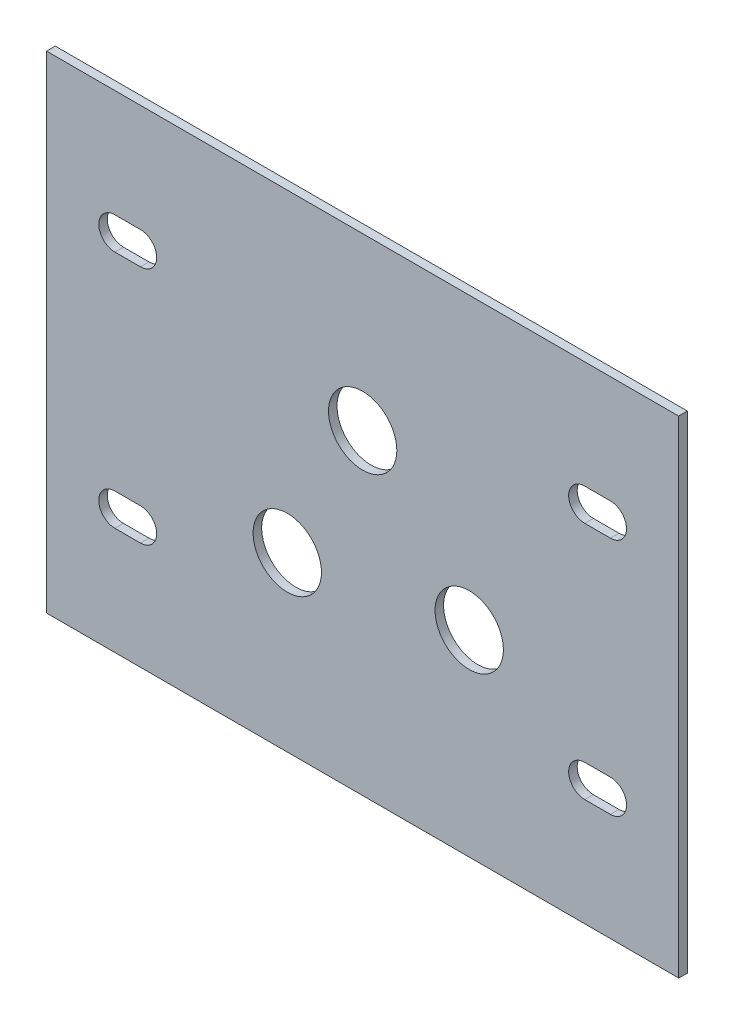
ISO-10303-21;
HEADER;
FILE_DESCRIPTION(('STEP AP214'),'2;1');
FILE_NAME('part.step','',(''),(''),'','','');
FILE_SCHEMA(('AUTOMOTIVE_DESIGN { 1 0 10303 214 1 1 1 1 }'));
ENDSEC;
DATA;
#1=APPLICATION_CONTEXT('core data for automotive mechanical design processes');
#2=APPLICATION_PROTOCOL_DEFINITION('international standard','automotive_design',2000,#1);
#3=PRODUCT_CONTEXT('',#1,'mechanical');
#4=PRODUCT('Part','Part','',(#3));
#5=PRODUCT_RELATED_PRODUCT_CATEGORY('part','',(#4));
#6=PRODUCT_DEFINITION_FORMATION('','',#4);
#7=PRODUCT_DEFINITION_CONTEXT('part definition',#1,'design');
#8=PRODUCT_DEFINITION('design','',#6,#7);
#9=PRODUCT_DEFINITION_SHAPE('','',#8);
#10=(LENGTH_UNIT() NAMED_UNIT(*) SI_UNIT(.MILLI.,.METRE.));
#11=(NAMED_UNIT(*) PLANE_ANGLE_UNIT() SI_UNIT($,.RADIAN.));
#12=(NAMED_UNIT(*) SI_UNIT($,.STERADIAN.) SOLID_ANGLE_UNIT());
#13=UNCERTAINTY_MEASURE_WITH_UNIT(LENGTH_MEASURE(1.E-05),#10,'distance_accuracy_value','');
#14=(GEOMETRIC_REPRESENTATION_CONTEXT(3) GLOBAL_UNCERTAINTY_ASSIGNED_CONTEXT((#13)) GLOBAL_UNIT_ASSIGNED_CONTEXT((#10,
#11,#12)) REPRESENTATION_CONTEXT('',''));
#15=CARTESIAN_POINT('',(0.,0.,0.));
#16=DIRECTION('',(0.,0.,1.));
#17=DIRECTION('',(1.,0.,0.));
#18=AXIS2_PLACEMENT_3D('',#15,#16,#17);
#19=CARTESIAN_POINT('',(0.,-90.4875,0.));
#20=DIRECTION('',(0.,-0.999847695156391,0.0174524064372835));
#21=DIRECTION('',(-1.,0.,0.));
#22=AXIS2_PLACEMENT_3D('',#19,#20,#21);
#23=PLANE('',#22);
#24=DIRECTION('',(1.,0.,0.));
#25=VECTOR('',#24,1.);
#26=CARTESIAN_POINT('',(0.,-90.4875,0.));
#27=LINE('',#26,#25);
#28=CARTESIAN_POINT('',(-117.475,-90.4875,0.));
#29=VERTEX_POINT('',#28);
#30=CARTESIAN_POINT('',(117.475,-90.4875,0.));
#31=VERTEX_POINT('',#30);
#32=EDGE_CURVE('E296',#29,#31,#27,.T.);
#33=ORIENTED_EDGE('',*,*,#32,.T.);
#34=DIRECTION('',(0.0174497491606827,-0.0174497491606827,-0.999695459881887));
#35=VECTOR('',#34,1.);
#36=CARTESIAN_POINT('',(117.44744712218,-90.4599471221796,1.57850331314946));
#37=LINE('',#36,#35);
#38=CARTESIAN_POINT('',(117.419580168853,-90.4320801688529,3.175));
#39=VERTEX_POINT('',#38);
#40=EDGE_CURVE('E10',#39,#31,#37,.T.);
#41=ORIENTED_EDGE('',*,*,#40,.F.);
#42=DIRECTION('',(1.,0.,0.));
#43=VECTOR('',#42,1.);
#44=CARTESIAN_POINT('',(0.,-90.4320801688529,3.175));
#45=LINE('',#44,#43);
#46=CARTESIAN_POINT('',(-117.419580168853,-90.4320801688529,3.175));
#47=VERTEX_POINT('',#46);
#48=EDGE_CURVE('E332',#47,#39,#45,.T.);
#49=ORIENTED_EDGE('',*,*,#48,.F.);
#50=DIRECTION('',(-0.0174497491606827,-0.0174497491606827,-0.999695459881887));
#51=VECTOR('',#50,1.);
#52=CARTESIAN_POINT('',(-117.44744712218,-90.4599471221796,1.57850331314946));
#53=LINE('',#52,#51);
#54=EDGE_CURVE('E350',#47,#29,#53,.T.);
#55=ORIENTED_EDGE('',*,*,#54,.T.);
#56=EDGE_LOOP('',(#33,#41,#49,#55));
#57=FACE_BOUND('',#56,.T.);
#58=ADVANCED_FACE('F16',(#57),#23,.T.);
#59=CARTESIAN_POINT('',(117.475,0.,0.));
#60=DIRECTION('',(0.999847695156391,0.,0.0174524064372835));
#61=DIRECTION('',(0.,-1.,0.));
#62=AXIS2_PLACEMENT_3D('',#59,#60,#61);
#63=PLANE('',#62);
#64=DIRECTION('',(0.,1.,0.));
#65=VECTOR('',#64,1.);
#66=CARTESIAN_POINT('',(117.475,0.,0.));
#67=LINE('',#66,#65);
#68=CARTESIAN_POINT('',(117.475,90.4875,0.));
#69=VERTEX_POINT('',#68);
#70=EDGE_CURVE('E327',#31,#69,#67,.T.);
#71=ORIENTED_EDGE('',*,*,#70,.T.);
#72=DIRECTION('',(0.0174497491606827,0.0174497491606827,-0.999695459881887));
#73=VECTOR('',#72,1.);
#74=CARTESIAN_POINT('',(117.44744712218,90.4599471221795,1.57850331314946));
#75=LINE('',#74,#73);
#76=CARTESIAN_POINT('',(117.419580168853,90.4320801688529,3.175));
#77=VERTEX_POINT('',#76);
#78=EDGE_CURVE('E27',#77,#69,#75,.T.);
#79=ORIENTED_EDGE('',*,*,#78,.F.);
#80=DIRECTION('',(0.,1.,0.));
#81=VECTOR('',#80,1.);
#82=CARTESIAN_POINT('',(117.419580168853,0.,3.175));
#83=LINE('',#82,#81);
#84=EDGE_CURVE('E337',#39,#77,#83,.T.);
#85=ORIENTED_EDGE('',*,*,#84,.F.);
#86=ORIENTED_EDGE('',*,*,#40,.T.);
#87=EDGE_LOOP('',(#71,#79,#85,#86));
#88=FACE_BOUND('',#87,.T.);
#89=ADVANCED_FACE('F18',(#88),#63,.T.);
#90=CARTESIAN_POINT('',(0.,90.4875,0.));
#91=DIRECTION('',(0.,0.999847695156391,0.0174524064372835));
#92=DIRECTION('',(1.,0.,0.));
#93=AXIS2_PLACEMENT_3D('',#90,#91,#92);
#94=PLANE('',#93);
#95=DIRECTION('',(1.,0.,0.));
#96=VECTOR('',#95,1.);
#97=CARTESIAN_POINT('',(0.,90.4875,0.));
#98=LINE('',#97,#96);
#99=CARTESIAN_POINT('',(-117.475,90.4875,0.));
#100=VERTEX_POINT('',#99);
#101=EDGE_CURVE('E323',#100,#69,#98,.T.);
#102=ORIENTED_EDGE('',*,*,#101,.F.);
#103=DIRECTION('',(-0.0174497491606827,0.0174497491606827,-0.999695459881887));
#104=VECTOR('',#103,1.);
#105=CARTESIAN_POINT('',(-117.44744712218,90.4599471221795,1.57850331314946));
#106=LINE('',#105,#104);
#107=CARTESIAN_POINT('',(-117.419580168853,90.4320801688529,3.175));
#108=VERTEX_POINT('',#107);
#109=EDGE_CURVE('E20',#108,#100,#106,.T.);
#110=ORIENTED_EDGE('',*,*,#109,.F.);
#111=DIRECTION('',(1.,0.,0.));
#112=VECTOR('',#111,1.);
#113=CARTESIAN_POINT('',(0.,90.4320801688529,3.175));
#114=LINE('',#113,#112);
#115=EDGE_CURVE('E341',#108,#77,#114,.T.);
#116=ORIENTED_EDGE('',*,*,#115,.T.);
#117=ORIENTED_EDGE('',*,*,#78,.T.);
#118=EDGE_LOOP('',(#102,#110,#116,#117));
#119=FACE_BOUND('',#118,.T.);
#120=ADVANCED_FACE('F363',(#119),#94,.T.);
#121=CARTESIAN_POINT('',(-117.475,0.,0.));
#122=DIRECTION('',(-0.999847695156391,0.,0.0174524064372835));
#123=DIRECTION('',(0.,1.,0.));
#124=AXIS2_PLACEMENT_3D('',#121,#122,#123);
#125=PLANE('',#124);
#126=DIRECTION('',(0.,1.,0.));
#127=VECTOR('',#126,1.);
#128=CARTESIAN_POINT('',(-117.475,0.,0.));
#129=LINE('',#128,#127);
#130=EDGE_CURVE('E299',#29,#100,#129,.T.);
#131=ORIENTED_EDGE('',*,*,#130,.F.);
#132=ORIENTED_EDGE('',*,*,#54,.F.);
#133=DIRECTION('',(0.,1.,0.));
#134=VECTOR('',#133,1.);
#135=CARTESIAN_POINT('',(-117.419580168853,0.,3.175));
#136=LINE('',#135,#134);
#137=EDGE_CURVE('E342',#47,#108,#136,.T.);
#138=ORIENTED_EDGE('',*,*,#137,.T.);
#139=ORIENTED_EDGE('',*,*,#109,.T.);
#140=EDGE_LOOP('',(#131,#132,#138,#139));
#141=FACE_BOUND('',#140,.T.);
#142=ADVANCED_FACE('F360',(#141),#125,.T.);
#143=CARTESIAN_POINT('',(0.,0.,3.175));
#144=DIRECTION('',(0.,0.,1.));
#145=DIRECTION('',(1.,0.,0.));
#146=AXIS2_PLACEMENT_3D('',#143,#144,#145);
#147=PLANE('',#146);
#148=CARTESIAN_POINT('',(39.6028704669127,-17.3651704669118,3.175));
#149=DIRECTION('',(0.,0.,1.));
#150=DIRECTION('',(1.,0.,0.));
#151=AXIS2_PLACEMENT_3D('',#148,#149,#150);
#152=CIRCLE('',#151,12.7);
#153=CARTESIAN_POINT('',(52.3028704669127,-17.3651704669118,3.175));
#154=VERTEX_POINT('',#153);
#155=EDGE_CURVE('E730',#154,#154,#152,.T.);
#156=ORIENTED_EDGE('',*,*,#155,.F.);
#157=EDGE_LOOP('',(#156));
#158=FACE_BOUND('',#157,.T.);
#159=CARTESIAN_POINT('',(-82.55,44.45,3.175));
#160=DIRECTION('',(0.,0.,1.));
#161=DIRECTION('',(1.,0.,0.));
#162=AXIS2_PLACEMENT_3D('',#159,#160,#161);
#163=CIRCLE('',#162,5.9944);
#164=CARTESIAN_POINT('',(-82.55,38.4556,3.175));
#165=VERTEX_POINT('',#164);
#166=CARTESIAN_POINT('',(-82.55,50.4444,3.175));
#167=VERTEX_POINT('',#166);
#168=EDGE_CURVE('E713',#165,#167,#163,.T.);
#169=ORIENTED_EDGE('',*,*,#168,.F.);
#170=DIRECTION('',(1.,0.,0.));
#171=VECTOR('',#170,1.);
#172=CARTESIAN_POINT('',(-82.55,38.4556,3.175));
#173=LINE('',#172,#171);
#174=CARTESIAN_POINT('',(-92.075,38.4556,3.175));
#175=VERTEX_POINT('',#174);
#176=EDGE_CURVE('E897',#175,#165,#173,.T.);
#177=ORIENTED_EDGE('',*,*,#176,.F.);
#178=CARTESIAN_POINT('',(-92.075,44.45,3.175));
#179=DIRECTION('',(0.,0.,1.));
#180=DIRECTION('',(1.,0.,0.));
#181=AXIS2_PLACEMENT_3D('',#178,#179,#180);
#182=CIRCLE('',#181,5.9944);
#183=CARTESIAN_POINT('',(-92.075,50.4444,3.175));
#184=VERTEX_POINT('',#183);
#185=EDGE_CURVE('E759',#184,#175,#182,.T.);
#186=ORIENTED_EDGE('',*,*,#185,.F.);
#187=DIRECTION('',(-1.,0.,0.));
#188=VECTOR('',#187,1.);
#189=CARTESIAN_POINT('',(-82.55,50.4444,3.175));
#190=LINE('',#189,#188);
#191=EDGE_CURVE('E631',#167,#184,#190,.T.);
#192=ORIENTED_EDGE('',*,*,#191,.F.);
#193=EDGE_LOOP('',(#169,#177,#186,#192));
#194=FACE_BOUND('',#193,.T.);
#195=CARTESIAN_POINT('',(-82.55,-44.45,3.175));
#196=DIRECTION('',(0.,0.,1.));
#197=DIRECTION('',(1.,0.,0.));
#198=AXIS2_PLACEMENT_3D('',#195,#196,#197);
#199=CIRCLE('',#198,5.9944);
#200=CARTESIAN_POINT('',(-82.55,-50.4444,3.175));
#201=VERTEX_POINT('',#200);
#202=CARTESIAN_POINT('',(-82.55,-38.4556,3.175));
#203=VERTEX_POINT('',#202);
#204=EDGE_CURVE('E696',#201,#203,#199,.T.);
#205=ORIENTED_EDGE('',*,*,#204,.F.);
#206=DIRECTION('',(1.,0.,0.));
#207=VECTOR('',#206,1.);
#208=CARTESIAN_POINT('',(-82.55,-50.4444,3.175));
#209=LINE('',#208,#207);
#210=CARTESIAN_POINT('',(-92.075,-50.4444,3.175));
#211=VERTEX_POINT('',#210);
#212=EDGE_CURVE('E216',#211,#201,#209,.T.);
#213=ORIENTED_EDGE('',*,*,#212,.F.);
#214=CARTESIAN_POINT('',(-92.075,-44.45,3.175));
#215=DIRECTION('',(0.,0.,1.));
#216=DIRECTION('',(1.,0.,0.));
#217=AXIS2_PLACEMENT_3D('',#214,#215,#216);
#218=CIRCLE('',#217,5.9944);
#219=CARTESIAN_POINT('',(-92.075,-38.4556,3.175));
#220=VERTEX_POINT('',#219);
#221=EDGE_CURVE('E227',#220,#211,#218,.T.);
#222=ORIENTED_EDGE('',*,*,#221,.F.);
#223=DIRECTION('',(-1.,0.,0.));
#224=VECTOR('',#223,1.);
#225=CARTESIAN_POINT('',(-82.55,-38.4556,3.175));
#226=LINE('',#225,#224);
#227=EDGE_CURVE('E230',#203,#220,#226,.T.);
#228=ORIENTED_EDGE('',*,*,#227,.F.);
#229=EDGE_LOOP('',(#205,#213,#222,#228));
#230=FACE_BOUND('',#229,.T.);
#231=CARTESIAN_POINT('',(92.075,-44.45,3.175));
#232=DIRECTION('',(0.,0.,1.));
#233=DIRECTION('',(1.,0.,0.));
#234=AXIS2_PLACEMENT_3D('',#231,#232,#233);
#235=CIRCLE('',#234,5.9944);
#236=CARTESIAN_POINT('',(92.075,-50.4444,3.175));
#237=VERTEX_POINT('',#236);
#238=CARTESIAN_POINT('',(92.075,-38.4556,3.175));
#239=VERTEX_POINT('',#238);
#240=EDGE_CURVE('E679',#237,#239,#235,.T.);
#241=ORIENTED_EDGE('',*,*,#240,.F.);
#242=DIRECTION('',(1.,0.,0.));
#243=VECTOR('',#242,1.);
#244=CARTESIAN_POINT('',(92.075,-50.4444,3.175));
#245=LINE('',#244,#243);
#246=CARTESIAN_POINT('',(82.55,-50.4444,3.175));
#247=VERTEX_POINT('',#246);
#248=EDGE_CURVE('E282',#247,#237,#245,.T.);
#249=ORIENTED_EDGE('',*,*,#248,.F.);
#250=CARTESIAN_POINT('',(82.55,-44.45,3.175));
#251=DIRECTION('',(0.,0.,1.));
#252=DIRECTION('',(1.,0.,0.));
#253=AXIS2_PLACEMENT_3D('',#250,#251,#252);
#254=CIRCLE('',#253,5.9944);
#255=CARTESIAN_POINT('',(82.55,-38.4556,3.175));
#256=VERTEX_POINT('',#255);
#257=EDGE_CURVE('E270',#256,#247,#254,.T.);
#258=ORIENTED_EDGE('',*,*,#257,.F.);
#259=DIRECTION('',(-1.,0.,0.));
#260=VECTOR('',#259,1.);
#261=CARTESIAN_POINT('',(92.075,-38.4556,3.175));
#262=LINE('',#261,#260);
#263=EDGE_CURVE('E256',#239,#256,#262,.T.);
#264=ORIENTED_EDGE('',*,*,#263,.F.);
#265=EDGE_LOOP('',(#241,#249,#258,#264));
#266=FACE_BOUND('',#265,.T.);
#267=CARTESIAN_POINT('',(82.55,44.45,3.175));
#268=DIRECTION('',(0.,0.,1.));
#269=DIRECTION('',(1.,0.,0.));
#270=AXIS2_PLACEMENT_3D('',#267,#268,#269);
#271=CIRCLE('',#270,5.9944);
#272=CARTESIAN_POINT('',(82.55,50.4444,3.175));
#273=VERTEX_POINT('',#272);
#274=CARTESIAN_POINT('',(82.55,38.4556,3.175));
#275=VERTEX_POINT('',#274);
#276=EDGE_CURVE('E316',#273,#275,#271,.T.);
#277=ORIENTED_EDGE('',*,*,#276,.F.);
#278=DIRECTION('',(-1.,0.,0.));
#279=VECTOR('',#278,1.);
#280=CARTESIAN_POINT('',(82.55,50.4444,3.175));
#281=LINE('',#280,#279);
#282=CARTESIAN_POINT('',(92.075,50.4444,3.175));
#283=VERTEX_POINT('',#282);
#284=EDGE_CURVE('E278',#283,#273,#281,.T.);
#285=ORIENTED_EDGE('',*,*,#284,.F.);
#286=CARTESIAN_POINT('',(92.075,44.45,3.175));
#287=DIRECTION('',(0.,0.,1.));
#288=DIRECTION('',(1.,0.,0.));
#289=AXIS2_PLACEMENT_3D('',#286,#287,#288);
#290=CIRCLE('',#289,5.9944);
#291=CARTESIAN_POINT('',(92.075,38.4556,3.175));
#292=VERTEX_POINT('',#291);
#293=EDGE_CURVE('E665',#292,#283,#290,.T.);
#294=ORIENTED_EDGE('',*,*,#293,.F.);
#295=DIRECTION('',(1.,0.,0.));
#296=VECTOR('',#295,1.);
#297=CARTESIAN_POINT('',(82.55,38.4556,3.175));
#298=LINE('',#297,#296);
#299=EDGE_CURVE('E246',#275,#292,#298,.T.);
#300=ORIENTED_EDGE('',*,*,#299,.F.);
#301=EDGE_LOOP('',(#277,#285,#294,#300));
#302=FACE_BOUND('',#301,.T.);
#303=CARTESIAN_POINT('',(0.,27.0002,3.175));
#304=DIRECTION('',(0.,0.,1.));
#305=DIRECTION('',(1.,0.,0.));
#306=AXIS2_PLACEMENT_3D('',#303,#304,#305);
#307=CIRCLE('',#306,12.7);
#308=CARTESIAN_POINT('',(12.7,27.0002,3.175));
#309=VERTEX_POINT('',#308);
#310=EDGE_CURVE('E643',#309,#309,#307,.T.);
#311=ORIENTED_EDGE('',*,*,#310,.F.);
#312=EDGE_LOOP('',(#311));
#313=FACE_BOUND('',#312,.T.);
#314=CARTESIAN_POINT('',(-28.0035,-26.2657847897549,3.175));
#315=DIRECTION('',(0.,0.,1.));
#316=DIRECTION('',(1.,0.,0.));
#317=AXIS2_PLACEMENT_3D('',#314,#315,#316);
#318=CIRCLE('',#317,12.7);
#319=CARTESIAN_POINT('',(-15.3035,-26.2657847897549,3.175));
#320=VERTEX_POINT('',#319);
#321=EDGE_CURVE('E626',#320,#320,#318,.T.);
#322=ORIENTED_EDGE('',*,*,#321,.F.);
#323=EDGE_LOOP('',(#322));
#324=FACE_BOUND('',#323,.T.);
#325=ORIENTED_EDGE('',*,*,#48,.T.);
#326=ORIENTED_EDGE('',*,*,#84,.T.);
#327=ORIENTED_EDGE('',*,*,#115,.F.);
#328=ORIENTED_EDGE('',*,*,#137,.F.);
#329=EDGE_LOOP('',(#325,#326,#327,#328));
#330=FACE_BOUND('',#329,.T.);
#331=ADVANCED_FACE('F364',(#158,#194,#230,#266,#302,#313,#324,#330),#147,.T.);
#332=CARTESIAN_POINT('',(0.,0.,0.));
#333=DIRECTION('',(0.,0.,1.));
#334=DIRECTION('',(1.,0.,0.));
#335=AXIS2_PLACEMENT_3D('',#332,#333,#334);
#336=PLANE('',#335);
#337=CARTESIAN_POINT('',(39.6028704669127,-17.3651704669118,0.));
#338=DIRECTION('',(0.,0.,1.));
#339=DIRECTION('',(1.,0.,0.));
#340=AXIS2_PLACEMENT_3D('',#337,#338,#339);
#341=CIRCLE('',#340,12.7);
#342=CARTESIAN_POINT('',(52.3028704669127,-17.3651704669118,0.));
#343=VERTEX_POINT('',#342);
#344=EDGE_CURVE('E734',#343,#343,#341,.T.);
#345=ORIENTED_EDGE('',*,*,#344,.T.);
#346=EDGE_LOOP('',(#345));
#347=FACE_BOUND('',#346,.T.);
#348=DIRECTION('',(1.,0.,0.));
#349=VECTOR('',#348,1.);
#350=CARTESIAN_POINT('',(0.,38.4556,0.));
#351=LINE('',#350,#349);
#352=CARTESIAN_POINT('',(-92.075,38.4556,0.));
#353=VERTEX_POINT('',#352);
#354=CARTESIAN_POINT('',(-82.55,38.4556,0.));
#355=VERTEX_POINT('',#354);
#356=EDGE_CURVE('E236',#353,#355,#351,.T.);
#357=ORIENTED_EDGE('',*,*,#356,.T.);
#358=CARTESIAN_POINT('',(-82.55,44.45,0.));
#359=DIRECTION('',(0.,0.,1.));
#360=DIRECTION('',(1.,0.,0.));
#361=AXIS2_PLACEMENT_3D('',#358,#359,#360);
#362=CIRCLE('',#361,5.9944);
#363=CARTESIAN_POINT('',(-82.55,50.4444,0.));
#364=VERTEX_POINT('',#363);
#365=EDGE_CURVE('E716',#355,#364,#362,.T.);
#366=ORIENTED_EDGE('',*,*,#365,.T.);
#367=DIRECTION('',(-1.,0.,0.));
#368=VECTOR('',#367,1.);
#369=CARTESIAN_POINT('',(0.,50.4444,0.));
#370=LINE('',#369,#368);
#371=CARTESIAN_POINT('',(-92.075,50.4444,0.));
#372=VERTEX_POINT('',#371);
#373=EDGE_CURVE('E751',#364,#372,#370,.T.);
#374=ORIENTED_EDGE('',*,*,#373,.T.);
#375=CARTESIAN_POINT('',(-92.075,44.45,0.));
#376=DIRECTION('',(0.,0.,1.));
#377=DIRECTION('',(1.,0.,0.));
#378=AXIS2_PLACEMENT_3D('',#375,#376,#377);
#379=CIRCLE('',#378,5.9944);
#380=EDGE_CURVE('E843',#372,#353,#379,.T.);
#381=ORIENTED_EDGE('',*,*,#380,.T.);
#382=EDGE_LOOP('',(#357,#366,#374,#381));
#383=FACE_BOUND('',#382,.T.);
#384=DIRECTION('',(1.,0.,0.));
#385=VECTOR('',#384,1.);
#386=CARTESIAN_POINT('',(0.,-50.4444,0.));
#387=LINE('',#386,#385);
#388=CARTESIAN_POINT('',(-92.075,-50.4444,0.));
#389=VERTEX_POINT('',#388);
#390=CARTESIAN_POINT('',(-82.55,-50.4444,0.));
#391=VERTEX_POINT('',#390);
#392=EDGE_CURVE('E254',#389,#391,#387,.T.);
#393=ORIENTED_EDGE('',*,*,#392,.T.);
#394=CARTESIAN_POINT('',(-82.55,-44.45,0.));
#395=DIRECTION('',(0.,0.,1.));
#396=DIRECTION('',(1.,0.,0.));
#397=AXIS2_PLACEMENT_3D('',#394,#395,#396);
#398=CIRCLE('',#397,5.9944);
#399=CARTESIAN_POINT('',(-82.55,-38.4556,0.));
#400=VERTEX_POINT('',#399);
#401=EDGE_CURVE('E225',#391,#400,#398,.T.);
#402=ORIENTED_EDGE('',*,*,#401,.T.);
#403=DIRECTION('',(-1.,0.,0.));
#404=VECTOR('',#403,1.);
#405=CARTESIAN_POINT('',(0.,-38.4556,0.));
#406=LINE('',#405,#404);
#407=CARTESIAN_POINT('',(-92.075,-38.4556,0.));
#408=VERTEX_POINT('',#407);
#409=EDGE_CURVE('E218',#400,#408,#406,.T.);
#410=ORIENTED_EDGE('',*,*,#409,.T.);
#411=CARTESIAN_POINT('',(-92.075,-44.45,0.));
#412=DIRECTION('',(0.,0.,1.));
#413=DIRECTION('',(1.,0.,0.));
#414=AXIS2_PLACEMENT_3D('',#411,#412,#413);
#415=CIRCLE('',#414,5.9944);
#416=EDGE_CURVE('E204',#408,#389,#415,.T.);
#417=ORIENTED_EDGE('',*,*,#416,.T.);
#418=EDGE_LOOP('',(#393,#402,#410,#417));
#419=FACE_BOUND('',#418,.T.);
#420=DIRECTION('',(1.,0.,0.));
#421=VECTOR('',#420,1.);
#422=CARTESIAN_POINT('',(0.,-50.4444,0.));
#423=LINE('',#422,#421);
#424=CARTESIAN_POINT('',(82.55,-50.4444,0.));
#425=VERTEX_POINT('',#424);
#426=CARTESIAN_POINT('',(92.075,-50.4444,0.));
#427=VERTEX_POINT('',#426);
#428=EDGE_CURVE('E250',#425,#427,#423,.T.);
#429=ORIENTED_EDGE('',*,*,#428,.T.);
#430=CARTESIAN_POINT('',(92.075,-44.45,0.));
#431=DIRECTION('',(0.,0.,1.));
#432=DIRECTION('',(1.,0.,0.));
#433=AXIS2_PLACEMENT_3D('',#430,#431,#432);
#434=CIRCLE('',#433,5.9944);
#435=CARTESIAN_POINT('',(92.075,-38.4556,0.));
#436=VERTEX_POINT('',#435);
#437=EDGE_CURVE('E684',#427,#436,#434,.T.);
#438=ORIENTED_EDGE('',*,*,#437,.T.);
#439=DIRECTION('',(-1.,0.,0.));
#440=VECTOR('',#439,1.);
#441=CARTESIAN_POINT('',(0.,-38.4556,0.));
#442=LINE('',#441,#440);
#443=CARTESIAN_POINT('',(82.55,-38.4556,0.));
#444=VERTEX_POINT('',#443);
#445=EDGE_CURVE('E263',#436,#444,#442,.T.);
#446=ORIENTED_EDGE('',*,*,#445,.T.);
#447=CARTESIAN_POINT('',(82.55,-44.45,0.));
#448=DIRECTION('',(0.,0.,1.));
#449=DIRECTION('',(1.,0.,0.));
#450=AXIS2_PLACEMENT_3D('',#447,#448,#449);
#451=CIRCLE('',#450,5.9944);
#452=EDGE_CURVE('E274',#444,#425,#451,.T.);
#453=ORIENTED_EDGE('',*,*,#452,.T.);
#454=EDGE_LOOP('',(#429,#438,#446,#453));
#455=FACE_BOUND('',#454,.T.);
#456=DIRECTION('',(-1.,0.,0.));
#457=VECTOR('',#456,1.);
#458=CARTESIAN_POINT('',(0.,50.4444,0.));
#459=LINE('',#458,#457);
#460=CARTESIAN_POINT('',(92.075,50.4444,0.));
#461=VERTEX_POINT('',#460);
#462=CARTESIAN_POINT('',(82.55,50.4444,0.));
#463=VERTEX_POINT('',#462);
#464=EDGE_CURVE('E315',#461,#463,#459,.T.);
#465=ORIENTED_EDGE('',*,*,#464,.T.);
#466=CARTESIAN_POINT('',(82.55,44.45,0.));
#467=DIRECTION('',(0.,0.,1.));
#468=DIRECTION('',(1.,0.,0.));
#469=AXIS2_PLACEMENT_3D('',#466,#467,#468);
#470=CIRCLE('',#469,5.9944);
#471=CARTESIAN_POINT('',(82.55,38.4556,0.));
#472=VERTEX_POINT('',#471);
#473=EDGE_CURVE('E301',#463,#472,#470,.T.);
#474=ORIENTED_EDGE('',*,*,#473,.T.);
#475=DIRECTION('',(1.,0.,0.));
#476=VECTOR('',#475,1.);
#477=CARTESIAN_POINT('',(0.,38.4556,0.));
#478=LINE('',#477,#476);
#479=CARTESIAN_POINT('',(92.075,38.4556,0.));
#480=VERTEX_POINT('',#479);
#481=EDGE_CURVE('E277',#472,#480,#478,.T.);
#482=ORIENTED_EDGE('',*,*,#481,.T.);
#483=CARTESIAN_POINT('',(92.075,44.45,0.));
#484=DIRECTION('',(0.,0.,1.));
#485=DIRECTION('',(1.,0.,0.));
#486=AXIS2_PLACEMENT_3D('',#483,#484,#485);
#487=CIRCLE('',#486,5.9944);
#488=EDGE_CURVE('E667',#480,#461,#487,.T.);
#489=ORIENTED_EDGE('',*,*,#488,.T.);
#490=EDGE_LOOP('',(#465,#474,#482,#489));
#491=FACE_BOUND('',#490,.T.);
#492=CARTESIAN_POINT('',(0.,27.0002,0.));
#493=DIRECTION('',(0.,0.,1.));
#494=DIRECTION('',(1.,0.,0.));
#495=AXIS2_PLACEMENT_3D('',#492,#493,#494);
#496=CIRCLE('',#495,12.7);
#497=CARTESIAN_POINT('',(12.7,27.0002,0.));
#498=VERTEX_POINT('',#497);
#499=EDGE_CURVE('E647',#498,#498,#496,.T.);
#500=ORIENTED_EDGE('',*,*,#499,.T.);
#501=EDGE_LOOP('',(#500));
#502=FACE_BOUND('',#501,.T.);
#503=CARTESIAN_POINT('',(-28.0035,-26.2657847897549,0.));
#504=DIRECTION('',(0.,0.,1.));
#505=DIRECTION('',(1.,0.,0.));
#506=AXIS2_PLACEMENT_3D('',#503,#504,#505);
#507=CIRCLE('',#506,12.7);
#508=CARTESIAN_POINT('',(-15.3035,-26.2657847897549,0.));
#509=VERTEX_POINT('',#508);
#510=EDGE_CURVE('E635',#509,#509,#507,.T.);
#511=ORIENTED_EDGE('',*,*,#510,.T.);
#512=EDGE_LOOP('',(#511));
#513=FACE_BOUND('',#512,.T.);
#514=ORIENTED_EDGE('',*,*,#32,.F.);
#515=ORIENTED_EDGE('',*,*,#130,.T.);
#516=ORIENTED_EDGE('',*,*,#101,.T.);
#517=ORIENTED_EDGE('',*,*,#70,.F.);
#518=EDGE_LOOP('',(#514,#515,#516,#517));
#519=FACE_BOUND('',#518,.T.);
#520=ADVANCED_FACE('F219',(#347,#383,#419,#455,#491,#502,#513,#519),#336,.F.);
#521=CARTESIAN_POINT('',(82.55,44.45,-28.575));
#522=DIRECTION('',(0.,0.,1.));
#523=DIRECTION('',(1.,0.,0.));
#524=AXIS2_PLACEMENT_3D('',#521,#522,#523);
#525=CYLINDRICAL_SURFACE('',#524,5.9944);
#526=DIRECTION('',(0.,0.,1.));
#527=VECTOR('',#526,1.);
#528=CARTESIAN_POINT('',(82.55,50.4444,-28.575));
#529=LINE('',#528,#527);
#530=EDGE_CURVE('E306',#463,#273,#529,.T.);
#531=ORIENTED_EDGE('',*,*,#530,.T.);
#532=ORIENTED_EDGE('',*,*,#276,.T.);
#533=DIRECTION('',(0.,0.,1.));
#534=VECTOR('',#533,1.);
#535=CARTESIAN_POINT('',(82.55,38.4556,-28.575));
#536=LINE('',#535,#534);
#537=EDGE_CURVE('E242',#472,#275,#536,.T.);
#538=ORIENTED_EDGE('',*,*,#537,.F.);
#539=ORIENTED_EDGE('',*,*,#473,.F.);
#540=EDGE_LOOP('',(#531,#532,#538,#539));
#541=FACE_BOUND('',#540,.T.);
#542=ADVANCED_FACE('F372',(#541),#525,.F.);
#543=CARTESIAN_POINT('',(82.55,50.4444,-28.575));
#544=DIRECTION('',(0.,1.,0.));
#545=DIRECTION('',(1.,0.,0.));
#546=AXIS2_PLACEMENT_3D('',#543,#544,#545);
#547=PLANE('',#546);
#548=DIRECTION('',(0.,0.,1.));
#549=VECTOR('',#548,1.);
#550=CARTESIAN_POINT('',(92.075,50.4444,-28.575));
#551=LINE('',#550,#549);
#552=EDGE_CURVE('E660',#461,#283,#551,.T.);
#553=ORIENTED_EDGE('',*,*,#552,.T.);
#554=ORIENTED_EDGE('',*,*,#284,.T.);
#555=ORIENTED_EDGE('',*,*,#530,.F.);
#556=ORIENTED_EDGE('',*,*,#464,.F.);
#557=EDGE_LOOP('',(#553,#554,#555,#556));
#558=FACE_BOUND('',#557,.T.);
#559=ADVANCED_FACE('F421',(#558),#547,.F.);
#560=CARTESIAN_POINT('',(82.55,38.4556,-28.575));
#561=DIRECTION('',(0.,-1.,0.));
#562=DIRECTION('',(0.,0.,-1.));
#563=AXIS2_PLACEMENT_3D('',#560,#561,#562);
#564=PLANE('',#563);
#565=ORIENTED_EDGE('',*,*,#537,.T.);
#566=ORIENTED_EDGE('',*,*,#299,.T.);
#567=DIRECTION('',(0.,0.,1.));
#568=VECTOR('',#567,1.);
#569=CARTESIAN_POINT('',(92.075,38.4556,-28.575));
#570=LINE('',#569,#568);
#571=EDGE_CURVE('E281',#480,#292,#570,.T.);
#572=ORIENTED_EDGE('',*,*,#571,.F.);
#573=ORIENTED_EDGE('',*,*,#481,.F.);
#574=EDGE_LOOP('',(#565,#566,#572,#573));
#575=FACE_BOUND('',#574,.T.);
#576=ADVANCED_FACE('F432',(#575),#564,.F.);
#577=CARTESIAN_POINT('',(92.075,-50.4444,-28.575));
#578=DIRECTION('',(0.,-1.,0.));
#579=DIRECTION('',(-1.,0.,0.));
#580=AXIS2_PLACEMENT_3D('',#577,#578,#579);
#581=PLANE('',#580);
#582=DIRECTION('',(0.,0.,1.));
#583=VECTOR('',#582,1.);
#584=CARTESIAN_POINT('',(82.55,-50.4444,-28.575));
#585=LINE('',#584,#583);
#586=EDGE_CURVE('E271',#425,#247,#585,.T.);
#587=ORIENTED_EDGE('',*,*,#586,.T.);
#588=ORIENTED_EDGE('',*,*,#248,.T.);
#589=DIRECTION('',(0.,0.,1.));
#590=VECTOR('',#589,1.);
#591=CARTESIAN_POINT('',(92.075,-50.4444,-28.575));
#592=LINE('',#591,#590);
#593=EDGE_CURVE('E286',#427,#237,#592,.T.);
#594=ORIENTED_EDGE('',*,*,#593,.F.);
#595=ORIENTED_EDGE('',*,*,#428,.F.);
#596=EDGE_LOOP('',(#587,#588,#594,#595));
#597=FACE_BOUND('',#596,.T.);
#598=ADVANCED_FACE('F443',(#597),#581,.F.);
#599=CARTESIAN_POINT('',(82.55,-44.45,-28.575));
#600=DIRECTION('',(0.,0.,1.));
#601=DIRECTION('',(1.,0.,0.));
#602=AXIS2_PLACEMENT_3D('',#599,#600,#601);
#603=CYLINDRICAL_SURFACE('',#602,5.9944);
#604=DIRECTION('',(0.,0.,1.));
#605=VECTOR('',#604,1.);
#606=CARTESIAN_POINT('',(82.55,-38.4556,-28.575));
#607=LINE('',#606,#605);
#608=EDGE_CURVE('E259',#444,#256,#607,.T.);
#609=ORIENTED_EDGE('',*,*,#608,.T.);
#610=ORIENTED_EDGE('',*,*,#257,.T.);
#611=ORIENTED_EDGE('',*,*,#586,.F.);
#612=ORIENTED_EDGE('',*,*,#452,.F.);
#613=EDGE_LOOP('',(#609,#610,#611,#612));
#614=FACE_BOUND('',#613,.T.);
#615=ADVANCED_FACE('F460',(#614),#603,.F.);
#616=CARTESIAN_POINT('',(92.075,-38.4556,-28.575));
#617=DIRECTION('',(0.,1.,0.));
#618=DIRECTION('',(1.,0.,0.));
#619=AXIS2_PLACEMENT_3D('',#616,#617,#618);
#620=PLANE('',#619);
#621=DIRECTION('',(0.,0.,1.));
#622=VECTOR('',#621,1.);
#623=CARTESIAN_POINT('',(92.075,-38.4556,-28.575));
#624=LINE('',#623,#622);
#625=EDGE_CURVE('E674',#436,#239,#624,.T.);
#626=ORIENTED_EDGE('',*,*,#625,.T.);
#627=ORIENTED_EDGE('',*,*,#263,.T.);
#628=ORIENTED_EDGE('',*,*,#608,.F.);
#629=ORIENTED_EDGE('',*,*,#445,.F.);
#630=EDGE_LOOP('',(#626,#627,#628,#629));
#631=FACE_BOUND('',#630,.T.);
#632=ADVANCED_FACE('F470',(#631),#620,.F.);
#633=CARTESIAN_POINT('',(-82.55,-50.4444,-28.575));
#634=DIRECTION('',(0.,-1.,0.));
#635=DIRECTION('',(0.,0.,-1.));
#636=AXIS2_PLACEMENT_3D('',#633,#634,#635);
#637=PLANE('',#636);
#638=DIRECTION('',(0.,0.,1.));
#639=VECTOR('',#638,1.);
#640=CARTESIAN_POINT('',(-92.075,-50.4444,-28.575));
#641=LINE('',#640,#639);
#642=EDGE_CURVE('E215',#389,#211,#641,.T.);
#643=ORIENTED_EDGE('',*,*,#642,.T.);
#644=ORIENTED_EDGE('',*,*,#212,.T.);
#645=DIRECTION('',(0.,0.,1.));
#646=VECTOR('',#645,1.);
#647=CARTESIAN_POINT('',(-82.55,-50.4444,-28.575));
#648=LINE('',#647,#646);
#649=EDGE_CURVE('E253',#391,#201,#648,.T.);
#650=ORIENTED_EDGE('',*,*,#649,.F.);
#651=ORIENTED_EDGE('',*,*,#392,.F.);
#652=EDGE_LOOP('',(#643,#644,#650,#651));
#653=FACE_BOUND('',#652,.T.);
#654=ADVANCED_FACE('F476',(#653),#637,.F.);
#655=CARTESIAN_POINT('',(-92.075,-44.45,-28.575));
#656=DIRECTION('',(0.,0.,1.));
#657=DIRECTION('',(1.,0.,0.));
#658=AXIS2_PLACEMENT_3D('',#655,#656,#657);
#659=CYLINDRICAL_SURFACE('',#658,5.9944);
#660=DIRECTION('',(0.,0.,1.));
#661=VECTOR('',#660,1.);
#662=CARTESIAN_POINT('',(-92.075,-38.4556,-28.575));
#663=LINE('',#662,#661);
#664=EDGE_CURVE('E207',#408,#220,#663,.T.);
#665=ORIENTED_EDGE('',*,*,#664,.T.);
#666=ORIENTED_EDGE('',*,*,#221,.T.);
#667=ORIENTED_EDGE('',*,*,#642,.F.);
#668=ORIENTED_EDGE('',*,*,#416,.F.);
#669=EDGE_LOOP('',(#665,#666,#667,#668));
#670=FACE_BOUND('',#669,.T.);
#671=ADVANCED_FACE('F206',(#670),#659,.F.);
#672=CARTESIAN_POINT('',(-82.55,-38.4556,-28.575));
#673=DIRECTION('',(0.,1.,0.));
#674=DIRECTION('',(1.,0.,0.));
#675=AXIS2_PLACEMENT_3D('',#672,#673,#674);
#676=PLANE('',#675);
#677=DIRECTION('',(0.,0.,1.));
#678=VECTOR('',#677,1.);
#679=CARTESIAN_POINT('',(-82.55,-38.4556,-28.575));
#680=LINE('',#679,#678);
#681=EDGE_CURVE('E691',#400,#203,#680,.T.);
#682=ORIENTED_EDGE('',*,*,#681,.T.);
#683=ORIENTED_EDGE('',*,*,#227,.T.);
#684=ORIENTED_EDGE('',*,*,#664,.F.);
#685=ORIENTED_EDGE('',*,*,#409,.F.);
#686=EDGE_LOOP('',(#682,#683,#684,#685));
#687=FACE_BOUND('',#686,.T.);
#688=ADVANCED_FACE('F228',(#687),#676,.F.);
#689=CARTESIAN_POINT('',(-82.55,38.4556,-28.575));
#690=DIRECTION('',(0.,-1.,0.));
#691=DIRECTION('',(0.,0.,-1.));
#692=AXIS2_PLACEMENT_3D('',#689,#690,#691);
#693=PLANE('',#692);
#694=DIRECTION('',(0.,0.,1.));
#695=VECTOR('',#694,1.);
#696=CARTESIAN_POINT('',(-92.075,38.4556,-28.575));
#697=LINE('',#696,#695);
#698=EDGE_CURVE('E762',#353,#175,#697,.T.);
#699=ORIENTED_EDGE('',*,*,#698,.T.);
#700=ORIENTED_EDGE('',*,*,#176,.T.);
#701=DIRECTION('',(0.,0.,1.));
#702=VECTOR('',#701,1.);
#703=CARTESIAN_POINT('',(-82.55,38.4556,-28.575));
#704=LINE('',#703,#702);
#705=EDGE_CURVE('E241',#355,#165,#704,.T.);
#706=ORIENTED_EDGE('',*,*,#705,.F.);
#707=ORIENTED_EDGE('',*,*,#356,.F.);
#708=EDGE_LOOP('',(#699,#700,#706,#707));
#709=FACE_BOUND('',#708,.T.);
#710=ADVANCED_FACE('F508',(#709),#693,.F.);
#711=CARTESIAN_POINT('',(-92.075,44.45,-28.575));
#712=DIRECTION('',(0.,0.,1.));
#713=DIRECTION('',(1.,0.,0.));
#714=AXIS2_PLACEMENT_3D('',#711,#712,#713);
#715=CYLINDRICAL_SURFACE('',#714,5.9944);
#716=DIRECTION('',(0.,0.,1.));
#717=VECTOR('',#716,1.);
#718=CARTESIAN_POINT('',(-92.075,50.4444,-28.575));
#719=LINE('',#718,#717);
#720=EDGE_CURVE('E884',#372,#184,#719,.T.);
#721=ORIENTED_EDGE('',*,*,#720,.T.);
#722=ORIENTED_EDGE('',*,*,#185,.T.);
#723=ORIENTED_EDGE('',*,*,#698,.F.);
#724=ORIENTED_EDGE('',*,*,#380,.F.);
#725=EDGE_LOOP('',(#721,#722,#723,#724));
#726=FACE_BOUND('',#725,.T.);
#727=ADVANCED_FACE('F517',(#726),#715,.F.);
#728=CARTESIAN_POINT('',(-82.55,50.4444,-28.575));
#729=DIRECTION('',(0.,1.,0.));
#730=DIRECTION('',(1.,0.,0.));
#731=AXIS2_PLACEMENT_3D('',#728,#729,#730);
#732=PLANE('',#731);
#733=DIRECTION('',(0.,0.,1.));
#734=VECTOR('',#733,1.);
#735=CARTESIAN_POINT('',(-82.55,50.4444,-28.575));
#736=LINE('',#735,#734);
#737=EDGE_CURVE('E707',#364,#167,#736,.T.);
#738=ORIENTED_EDGE('',*,*,#737,.T.);
#739=ORIENTED_EDGE('',*,*,#191,.T.);
#740=ORIENTED_EDGE('',*,*,#720,.F.);
#741=ORIENTED_EDGE('',*,*,#373,.F.);
#742=EDGE_LOOP('',(#738,#739,#740,#741));
#743=FACE_BOUND('',#742,.T.);
#744=ADVANCED_FACE('F530',(#743),#732,.F.);
#745=CARTESIAN_POINT('',(-28.0035,-26.2657847897549,-28.575));
#746=DIRECTION('',(0.,0.,1.));
#747=DIRECTION('',(1.,0.,0.));
#748=AXIS2_PLACEMENT_3D('',#745,#746,#747);
#749=CYLINDRICAL_SURFACE('',#748,12.7);
#750=ORIENTED_EDGE('',*,*,#321,.T.);
#751=EDGE_LOOP('',(#750));
#752=FACE_BOUND('',#751,.T.);
#753=ORIENTED_EDGE('',*,*,#510,.F.);
#754=EDGE_LOOP('',(#753));
#755=FACE_BOUND('',#754,.T.);
#756=ADVANCED_FACE('F539',(#752,#755),#749,.F.);
#757=CARTESIAN_POINT('',(0.,27.0002,-28.575));
#758=DIRECTION('',(0.,0.,1.));
#759=DIRECTION('',(1.,0.,0.));
#760=AXIS2_PLACEMENT_3D('',#757,#758,#759);
#761=CYLINDRICAL_SURFACE('',#760,12.7);
#762=ORIENTED_EDGE('',*,*,#310,.T.);
#763=EDGE_LOOP('',(#762));
#764=FACE_BOUND('',#763,.T.);
#765=ORIENTED_EDGE('',*,*,#499,.F.);
#766=EDGE_LOOP('',(#765));
#767=FACE_BOUND('',#766,.T.);
#768=ADVANCED_FACE('F555',(#764,#767),#761,.F.);
#769=CARTESIAN_POINT('',(92.075,44.45,-28.575));
#770=DIRECTION('',(0.,0.,1.));
#771=DIRECTION('',(1.,0.,0.));
#772=AXIS2_PLACEMENT_3D('',#769,#770,#771);
#773=CYLINDRICAL_SURFACE('',#772,5.9944);
#774=ORIENTED_EDGE('',*,*,#488,.F.);
#775=ORIENTED_EDGE('',*,*,#571,.T.);
#776=ORIENTED_EDGE('',*,*,#293,.T.);
#777=ORIENTED_EDGE('',*,*,#552,.F.);
#778=EDGE_LOOP('',(#774,#775,#776,#777));
#779=FACE_BOUND('',#778,.T.);
#780=ADVANCED_FACE('F565',(#779),#773,.F.);
#781=CARTESIAN_POINT('',(92.075,-44.45,-28.575));
#782=DIRECTION('',(0.,0.,1.));
#783=DIRECTION('',(1.,0.,0.));
#784=AXIS2_PLACEMENT_3D('',#781,#782,#783);
#785=CYLINDRICAL_SURFACE('',#784,5.9944);
#786=ORIENTED_EDGE('',*,*,#437,.F.);
#787=ORIENTED_EDGE('',*,*,#593,.T.);
#788=ORIENTED_EDGE('',*,*,#240,.T.);
#789=ORIENTED_EDGE('',*,*,#625,.F.);
#790=EDGE_LOOP('',(#786,#787,#788,#789));
#791=FACE_BOUND('',#790,.T.);
#792=ADVANCED_FACE('F572',(#791),#785,.F.);
#793=CARTESIAN_POINT('',(-82.55,-44.45,-28.575));
#794=DIRECTION('',(0.,0.,1.));
#795=DIRECTION('',(1.,0.,0.));
#796=AXIS2_PLACEMENT_3D('',#793,#794,#795);
#797=CYLINDRICAL_SURFACE('',#796,5.9944);
#798=ORIENTED_EDGE('',*,*,#401,.F.);
#799=ORIENTED_EDGE('',*,*,#649,.T.);
#800=ORIENTED_EDGE('',*,*,#204,.T.);
#801=ORIENTED_EDGE('',*,*,#681,.F.);
#802=EDGE_LOOP('',(#798,#799,#800,#801));
#803=FACE_BOUND('',#802,.T.);
#804=ADVANCED_FACE('F585',(#803),#797,.F.);
#805=CARTESIAN_POINT('',(-82.55,44.45,-28.575));
#806=DIRECTION('',(0.,0.,1.));
#807=DIRECTION('',(1.,0.,0.));
#808=AXIS2_PLACEMENT_3D('',#805,#806,#807);
#809=CYLINDRICAL_SURFACE('',#808,5.9944);
#810=ORIENTED_EDGE('',*,*,#365,.F.);
#811=ORIENTED_EDGE('',*,*,#705,.T.);
#812=ORIENTED_EDGE('',*,*,#168,.T.);
#813=ORIENTED_EDGE('',*,*,#737,.F.);
#814=EDGE_LOOP('',(#810,#811,#812,#813));
#815=FACE_BOUND('',#814,.T.);
#816=ADVANCED_FACE('F594',(#815),#809,.F.);
#817=CARTESIAN_POINT('',(39.6028704669127,-17.3651704669118,-28.575));
#818=DIRECTION('',(0.,0.,1.));
#819=DIRECTION('',(1.,0.,0.));
#820=AXIS2_PLACEMENT_3D('',#817,#818,#819);
#821=CYLINDRICAL_SURFACE('',#820,12.7);
#822=ORIENTED_EDGE('',*,*,#155,.T.);
#823=EDGE_LOOP('',(#822));
#824=FACE_BOUND('',#823,.T.);
#825=ORIENTED_EDGE('',*,*,#344,.F.);
#826=EDGE_LOOP('',(#825));
#827=FACE_BOUND('',#826,.T.);
#828=ADVANCED_FACE('F607',(#824,#827),#821,.F.);
#829=CLOSED_SHELL('',(#58,#89,#120,#142,#331,#520,#542,#559,#576,#598,#615,#632,#654,#671,#688,
#710,#727,#744,#756,#768,#780,#792,#804,#816,#828));
#830=MANIFOLD_SOLID_BREP('B1',#829);
#831=ADVANCED_BREP_SHAPE_REPRESENTATION('',(#18,#830),#14);
#832=SHAPE_DEFINITION_REPRESENTATION(#9,#831);
ENDSEC;
END-ISO-10303-21;
